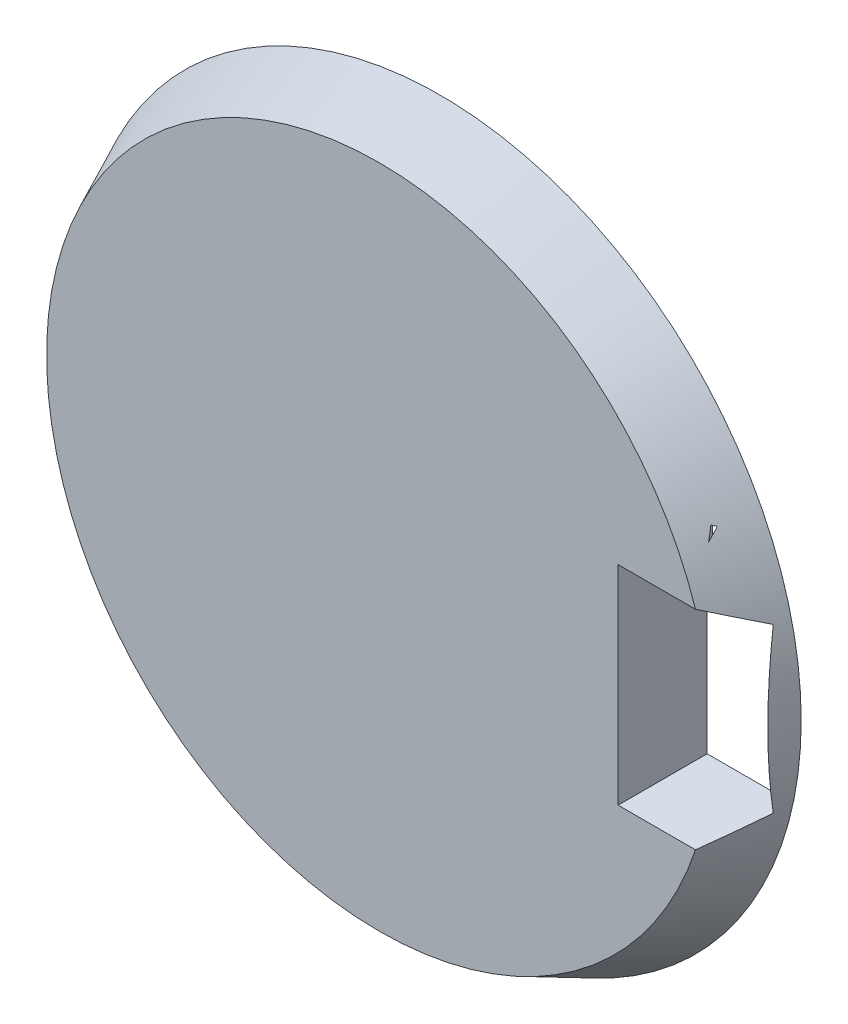
ISO-10303-21;
HEADER;
FILE_DESCRIPTION(('STEP AP214'),'2;1');
FILE_NAME('part.step','',(''),(''),'','','');
FILE_SCHEMA(('AUTOMOTIVE_DESIGN { 1 0 10303 214 1 1 1 1 }'));
ENDSEC;
DATA;
#1=APPLICATION_CONTEXT('core data for automotive mechanical design processes');
#2=APPLICATION_PROTOCOL_DEFINITION('international standard','automotive_design',2000,#1);
#3=PRODUCT_CONTEXT('',#1,'mechanical');
#4=PRODUCT('Part','Part','',(#3));
#5=PRODUCT_RELATED_PRODUCT_CATEGORY('part','',(#4));
#6=PRODUCT_DEFINITION_FORMATION('','',#4);
#7=PRODUCT_DEFINITION_CONTEXT('part definition',#1,'design');
#8=PRODUCT_DEFINITION('design','',#6,#7);
#9=PRODUCT_DEFINITION_SHAPE('','',#8);
#10=(LENGTH_UNIT() NAMED_UNIT(*) SI_UNIT(.MILLI.,.METRE.));
#11=(NAMED_UNIT(*) PLANE_ANGLE_UNIT() SI_UNIT($,.RADIAN.));
#12=(NAMED_UNIT(*) SI_UNIT($,.STERADIAN.) SOLID_ANGLE_UNIT());
#13=UNCERTAINTY_MEASURE_WITH_UNIT(LENGTH_MEASURE(1.E-05),#10,'distance_accuracy_value','');
#14=(GEOMETRIC_REPRESENTATION_CONTEXT(3) GLOBAL_UNCERTAINTY_ASSIGNED_CONTEXT((#13)) GLOBAL_UNIT_ASSIGNED_CONTEXT((#10,
#11,#12)) REPRESENTATION_CONTEXT('',''));
#15=CARTESIAN_POINT('',(0.,0.,0.));
#16=DIRECTION('',(0.,0.,1.));
#17=DIRECTION('',(1.,0.,0.));
#18=AXIS2_PLACEMENT_3D('',#15,#16,#17);
#19=CARTESIAN_POINT('',(8.8,2.5,0.));
#20=DIRECTION('',(0.,-0.90630778703665,0.4226182617407));
#21=DIRECTION('',(0.,-0.4226182617407,-0.90630778703665));
#22=AXIS2_PLACEMENT_3D('',#19,#20,#21);
#23=PLANE('',#22);
#24=DIRECTION('',(0.,0.4226182617407,0.906307787036649));
#25=VECTOR('',#24,1.);
#26=CARTESIAN_POINT('',(10.1707952564834,3.43261531631,2.));
#27=LINE('',#26,#25);
#28=CARTESIAN_POINT('',(10.1707952564834,2.5,0.));
#29=VERTEX_POINT('',#28);
#30=CARTESIAN_POINT('',(10.1707952564834,3.43261531631,2.));
#31=VERTEX_POINT('',#30);
#32=EDGE_CURVE('E64',#29,#31,#27,.T.);
#33=ORIENTED_EDGE('',*,*,#32,.F.);
#34=DIRECTION('',(-1.,0.,0.));
#35=VECTOR('',#34,1.);
#36=CARTESIAN_POINT('',(8.8,2.5,0.));
#37=LINE('',#36,#35);
#38=CARTESIAN_POINT('',(11.2,2.5,0.));
#39=VERTEX_POINT('',#38);
#40=EDGE_CURVE('E247',#39,#29,#37,.T.);
#41=ORIENTED_EDGE('',*,*,#40,.F.);
#42=DIRECTION('',(-0.389281620635026,-0.389281620635026,-0.834817129478987));
#43=VECTOR('',#42,1.);
#44=CARTESIAN_POINT('',(10.8363035676058,2.13630356760585,-0.779949516233904));
#45=LINE('',#44,#43);
#46=CARTESIAN_POINT('',(11.3930223122456,2.69302231224562,0.413937684423472));
#47=VERTEX_POINT('',#46);
#48=EDGE_CURVE('E241',#47,#39,#45,.T.);
#49=ORIENTED_EDGE('',*,*,#48,.F.);
#50=CARTESIAN_POINT('',(12.5694296653311,1.71421659334357,-1.6851179535963));
#51=CARTESIAN_POINT('',(12.4020881559186,1.8602663056751,-1.3719133347629));
#52=CARTESIAN_POINT('',(12.232067978909,2.00577406522976,-1.0598709374101));
#53=CARTESIAN_POINT('',(11.8860741135527,2.29553187277096,-0.438483313866315));
#54=CARTESIAN_POINT('',(11.7101000011039,2.43978183023921,-0.129138281792436));
#55=CARTESIAN_POINT('',(11.3520833270081,2.72646297041828,0.485651407301144));
#56=CARTESIAN_POINT('',(11.1700574020714,2.86889785580036,0.791104004725003));
#57=CARTESIAN_POINT('',(10.7988106397738,3.15208889698565,1.39840915237316));
#58=CARTESIAN_POINT('',(10.6095896895449,3.29284502640874,1.70026164602512));
#59=CARTESIAN_POINT('',(10.2229016935578,3.57255953685384,2.30011134944158));
#60=CARTESIAN_POINT('',(10.0254246793454,3.71151546278486,2.59810329424647));
#61=CARTESIAN_POINT('',(9.62150301454988,3.98706495719527,3.18902109195248));
#62=CARTESIAN_POINT('',(9.41505927677605,4.12365876416739,3.48194745630296));
#63=CARTESIAN_POINT('',(8.99150638037919,4.39436799117154,4.06248526705914));
#64=CARTESIAN_POINT('',(8.77437178869183,4.52847634189704,4.35008155328809));
#65=CARTESIAN_POINT('',(8.43997573568999,4.72705637819265,4.77593781539907));
#66=CARTESIAN_POINT('',(8.32703885436555,4.79283168038183,4.91699340614238));
#67=CARTESIAN_POINT('',(8.09806469727044,4.92341785634088,5.19703636420943));
#68=CARTESIAN_POINT('',(7.98202720531553,4.98822866236998,5.33602358626265));
#69=CARTESIAN_POINT('',(7.86434008736167,5.05250538160821,5.47386545549667));
#70=B_SPLINE_CURVE_WITH_KNOTS('',3,(#50,#51,#52,#53,#54,#55,#56,#57,#58,#59,#60,#61,#62,#63,#64,
#65,#66,#67,#68,#69),.UNSPECIFIED.,.F.,.F.,(4,2,2,2,2,2,2,2,2,4),(0.,1.15190984547732,
2.30390191560036,3.45295344705957,4.60202301108419,5.75252248133409,6.90290510440253,
8.05617082448155,8.63302507757688,9.20991965623952),.UNSPECIFIED.);
#71=CARTESIAN_POINT('',(10.4163659157247,3.43261531631,2.));
#72=VERTEX_POINT('',#71);
#73=EDGE_CURVE('E220',#47,#72,#70,.T.);
#74=ORIENTED_EDGE('',*,*,#73,.T.);
#75=DIRECTION('',(-1.,0.,0.));
#76=VECTOR('',#75,1.);
#77=CARTESIAN_POINT('',(8.8,3.43261531631,2.));
#78=LINE('',#77,#76);
#79=EDGE_CURVE('E211',#72,#31,#78,.T.);
#80=ORIENTED_EDGE('',*,*,#79,.T.);
#81=EDGE_LOOP('',(#33,#41,#49,#74,#80));
#82=FACE_BOUND('',#81,.T.);
#83=ADVANCED_FACE('F35',(#82),#23,.T.);
#84=CARTESIAN_POINT('',(0.,0.,2.));
#85=DIRECTION('',(0.,0.,1.));
#86=DIRECTION('',(1.,0.,0.));
#87=AXIS2_PLACEMENT_3D('',#84,#85,#86);
#88=PLANE('',#87);
#89=ORIENTED_EDGE('',*,*,#79,.F.);
#90=CARTESIAN_POINT('',(0.,0.,2.));
#91=DIRECTION('',(0.,0.,1.));
#92=DIRECTION('',(1.,0.,0.));
#93=AXIS2_PLACEMENT_3D('',#90,#91,#92);
#94=CIRCLE('',#93,10.96738468369);
#95=CARTESIAN_POINT('',(10.4163659157247,-3.43261531631,2.));
#96=VERTEX_POINT('',#95);
#97=EDGE_CURVE('E227',#72,#96,#94,.T.);
#98=ORIENTED_EDGE('',*,*,#97,.T.);
#99=DIRECTION('',(1.,0.,0.));
#100=VECTOR('',#99,1.);
#101=CARTESIAN_POINT('',(8.8,-3.43261531631,2.));
#102=LINE('',#101,#100);
#103=CARTESIAN_POINT('',(7.86738468369,-3.43261531631,2.));
#104=VERTEX_POINT('',#103);
#105=EDGE_CURVE('E259',#104,#96,#102,.T.);
#106=ORIENTED_EDGE('',*,*,#105,.F.);
#107=DIRECTION('',(0.,-1.,0.));
#108=VECTOR('',#107,1.);
#109=CARTESIAN_POINT('',(7.86738468369,2.5,2.));
#110=LINE('',#109,#108);
#111=CARTESIAN_POINT('',(7.86738468369,3.43261531631,2.));
#112=VERTEX_POINT('',#111);
#113=EDGE_CURVE('E210',#112,#104,#110,.T.);
#114=ORIENTED_EDGE('',*,*,#113,.F.);
#115=CARTESIAN_POINT('',(8.97108004322399,3.43261531631,2.));
#116=VERTEX_POINT('',#115);
#117=EDGE_CURVE('E203',#116,#112,#78,.T.);
#118=ORIENTED_EDGE('',*,*,#117,.F.);
#119=DIRECTION('',(-1.,0.,0.));
#120=VECTOR('',#119,1.);
#121=CARTESIAN_POINT('',(8.97108004322399,3.43261531631,2.));
#122=LINE('',#121,#120);
#123=EDGE_CURVE('E132',#31,#116,#122,.T.);
#124=ORIENTED_EDGE('',*,*,#123,.F.);
#125=EDGE_LOOP('',(#89,#98,#106,#114,#118,#124));
#126=FACE_BOUND('',#125,.T.);
#127=ADVANCED_FACE('F171',(#126),#88,.T.);
#128=CARTESIAN_POINT('',(0.,0.,0.));
#129=DIRECTION('',(0.,0.,1.));
#130=DIRECTION('',(1.,0.,0.));
#131=AXIS2_PLACEMENT_3D('',#128,#129,#130);
#132=PLANE('',#131);
#133=ORIENTED_EDGE('',*,*,#40,.T.);
#134=DIRECTION('',(0.,1.,0.));
#135=VECTOR('',#134,1.);
#136=CARTESIAN_POINT('',(10.1707952564834,0.,0.));
#137=LINE('',#136,#135);
#138=CARTESIAN_POINT('',(10.1707952564834,4.70675583792499,0.));
#139=VERTEX_POINT('',#138);
#140=EDGE_CURVE('E159',#29,#139,#137,.T.);
#141=ORIENTED_EDGE('',*,*,#140,.T.);
#142=DIRECTION('',(1.,0.,0.));
#143=VECTOR('',#142,1.);
#144=CARTESIAN_POINT('',(0.,4.70675583792499,0.));
#145=LINE('',#144,#143);
#146=CARTESIAN_POINT('',(8.97108004322399,4.70675583792499,0.));
#147=VERTEX_POINT('',#146);
#148=EDGE_CURVE('E272',#147,#139,#145,.T.);
#149=ORIENTED_EDGE('',*,*,#148,.F.);
#150=DIRECTION('',(0.,-1.,0.));
#151=VECTOR('',#150,1.);
#152=CARTESIAN_POINT('',(8.97108004322399,0.,0.));
#153=LINE('',#152,#151);
#154=CARTESIAN_POINT('',(8.97108004322399,2.5,0.));
#155=VERTEX_POINT('',#154);
#156=EDGE_CURVE('E140',#147,#155,#153,.T.);
#157=ORIENTED_EDGE('',*,*,#156,.T.);
#158=CARTESIAN_POINT('',(8.8,2.5,0.));
#159=VERTEX_POINT('',#158);
#160=EDGE_CURVE('E205',#155,#159,#37,.T.);
#161=ORIENTED_EDGE('',*,*,#160,.T.);
#162=DIRECTION('',(0.,-1.,0.));
#163=VECTOR('',#162,1.);
#164=CARTESIAN_POINT('',(8.8,2.5,0.));
#165=LINE('',#164,#163);
#166=CARTESIAN_POINT('',(8.8,-2.5,0.));
#167=VERTEX_POINT('',#166);
#168=EDGE_CURVE('E215',#159,#167,#165,.T.);
#169=ORIENTED_EDGE('',*,*,#168,.T.);
#170=DIRECTION('',(1.,0.,0.));
#171=VECTOR('',#170,1.);
#172=CARTESIAN_POINT('',(8.8,-2.5,0.));
#173=LINE('',#172,#171);
#174=CARTESIAN_POINT('',(11.2,-2.5,0.));
#175=VERTEX_POINT('',#174);
#176=EDGE_CURVE('E212',#167,#175,#173,.T.);
#177=ORIENTED_EDGE('',*,*,#176,.T.);
#178=DIRECTION('',(0.,1.,0.));
#179=VECTOR('',#178,1.);
#180=CARTESIAN_POINT('',(11.2,2.5,0.));
#181=LINE('',#180,#179);
#182=EDGE_CURVE('E271',#175,#39,#181,.T.);
#183=ORIENTED_EDGE('',*,*,#182,.T.);
#184=EDGE_LOOP('',(#133,#141,#149,#157,#161,#169,#177,#183));
#185=FACE_BOUND('',#184,.T.);
#186=CARTESIAN_POINT('',(0.,0.,0.));
#187=DIRECTION('',(0.,0.,1.));
#188=DIRECTION('',(1.,0.,0.));
#189=AXIS2_PLACEMENT_3D('',#186,#187,#188);
#190=CIRCLE('',#189,11.9);
#191=CARTESIAN_POINT('',(11.9,0.,0.));
#192=VERTEX_POINT('',#191);
#193=EDGE_CURVE('E249',#192,#192,#190,.T.);
#194=ORIENTED_EDGE('',*,*,#193,.F.);
#195=EDGE_LOOP('',(#194));
#196=FACE_BOUND('',#195,.T.);
#197=ADVANCED_FACE('F173',(#185,#196),#132,.F.);
#198=CARTESIAN_POINT('',(0.,0.,0.));
#199=DIRECTION('',(0.,0.,-1.));
#200=DIRECTION('',(1.,0.,0.));
#201=AXIS2_PLACEMENT_3D('',#198,#199,#200);
#202=CONICAL_SURFACE('',#201,11.9,0.436332312998583);
#203=CARTESIAN_POINT('',(10.1709952564834,5.18870743434082,1.03354853386437));
#204=CARTESIAN_POINT('',(10.1555656592916,5.19815759943512,1.05381447830907));
#205=CARTESIAN_POINT('',(10.1401120901725,5.20760074176662,1.07406536239033));
#206=CARTESIAN_POINT('',(10.109157007991,5.22647298095807,1.11453700994191));
#207=CARTESIAN_POINT('',(10.0936554949282,5.23590207781795,1.13475777341206));
#208=CARTESIAN_POINT('',(10.0781300099379,5.24532415191493,1.1549634765186));
#209=B_SPLINE_CURVE_WITH_KNOTS('',3,(#203,#204,#205,#206,#207,#208),.UNSPECIFIED.,.F.,.F.,(4,2,
4),(0.,0.0815031065368539,0.163006213540716),.UNSPECIFIED.);
#210=CARTESIAN_POINT('',(10.1707952564834,5.18882992539633,1.03381121678063));
#211=VERTEX_POINT('',#210);
#212=CARTESIAN_POINT('',(10.0782836852403,5.2452308903833,1.1547634765186));
#213=VERTEX_POINT('',#212);
#214=EDGE_CURVE('E11',#211,#213,#209,.T.);
#215=ORIENTED_EDGE('',*,*,#214,.F.);
#216=CARTESIAN_POINT('',(10.1707952564834,9.38576864131933,-4.15973362477265));
#217=CARTESIAN_POINT('',(10.1707952564834,9.22986084265301,-3.93301773600076));
#218=CARTESIAN_POINT('',(10.1707952564834,9.07255045182738,-3.70725647187416));
#219=CARTESIAN_POINT('',(10.1707952564834,8.75470122984462,-3.25797923497355));
#220=CARTESIAN_POINT('',(10.1707952564834,8.59416201492303,-3.03446353388875));
#221=CARTESIAN_POINT('',(10.1707952564834,8.26920640992656,-2.58970848647703));
#222=CARTESIAN_POINT('',(10.1707952564834,8.10478416910696,-2.36847340643358));
#223=CARTESIAN_POINT('',(10.1707952564834,7.77181757894781,-1.92913390604432));
#224=CARTESIAN_POINT('',(10.1707952564834,7.60327337745625,-1.71102937385489));
#225=CARTESIAN_POINT('',(10.1707952564834,7.26553436171465,-1.28369475821025));
#226=CARTESIAN_POINT('',(10.1707952564834,7.09645067344273,-1.07437703583552));
#227=CARTESIAN_POINT('',(10.1707952564834,6.75312756166177,-0.660016696897339));
#228=CARTESIAN_POINT('',(10.1707952564834,6.57888835194832,-0.454973903655201));
#229=CARTESIAN_POINT('',(10.1707952564834,6.22443916942975,-0.0500681812466166));
#230=CARTESIAN_POINT('',(10.1707952564834,6.044228735456,0.149794345703886));
#231=CARTESIAN_POINT('',(10.1707952564834,5.67691392075882,0.543065872521169));
#232=CARTESIAN_POINT('',(10.1707952564834,5.48981021664286,0.736475502238309));
#233=CARTESIAN_POINT('',(10.1707952564834,5.0573540133649,1.16498227580979));
#234=CARTESIAN_POINT('',(10.1707952564834,4.80961008049316,1.39768588992763));
#235=CARTESIAN_POINT('',(10.1707952564834,4.29898576094776,1.84519927593756));
#236=CARTESIAN_POINT('',(10.1707952564834,4.03613399389273,2.06004111010144));
#237=CARTESIAN_POINT('',(10.1707952564834,3.62601130610405,2.36527768329628));
#238=CARTESIAN_POINT('',(10.1707952564834,3.48556726611504,2.46485497007477));
#239=CARTESIAN_POINT('',(10.1707952564834,3.1995920311101,2.65633194557442));
#240=CARTESIAN_POINT('',(10.1707952564834,3.05406292476317,2.74823473518192));
#241=CARTESIAN_POINT('',(10.1707952564834,2.75666533909821,2.92343654879817));
#242=CARTESIAN_POINT('',(10.1707952564834,2.60476365976027,3.00667978730836));
#243=CARTESIAN_POINT('',(10.1707952564834,2.29517021391734,3.16215813469007));
#244=CARTESIAN_POINT('',(10.1707952564834,2.13747026824301,3.23437689018454));
#245=CARTESIAN_POINT('',(10.1707952564834,1.97695081742833,3.30007640350213));
#246=B_SPLINE_CURVE_WITH_KNOTS('',3,(#216,#217,#218,#219,#220,#221,#222,#223,#224,#225,#226,
#227,#228,#229,#230,#231,#232,#233,#234,#235,#236,#237,#238,#239,#240,#241,#242,#243,#244,#245),
.UNSPECIFIED.,.F.,.F.,(4,2,2,2,2,2,2,2,2,2,2,2,2,2,4),(0.,0.825455895391268,1.65101048767588,
2.47790027527318,3.30476044706047,4.11192503025201,4.91905618771885,5.72624982737459,
6.53336444709921,7.55247294423045,8.56971074110797,9.08600073875203,9.60208110937407,
10.1213033513969,10.6412884600426),.UNSPECIFIED.);
#247=CARTESIAN_POINT('',(10.1707952564834,4.88545142875096,1.32253139472464));
#248=VERTEX_POINT('',#247);
#249=EDGE_CURVE('E151',#211,#248,#246,.T.);
#250=ORIENTED_EDGE('',*,*,#249,.T.);
#251=CARTESIAN_POINT('',(0.,2.33277732196623,2.51286287949234));
#252=DIRECTION('',(0.,0.4226182617407,0.90630778703665));
#253=DIRECTION('',(0.,0.90630778703665,-0.4226182617407));
#254=AXIS2_PLACEMENT_3D('',#251,#252,#253);
#255=ELLIPSE('',#254,11.8372951759328,10.471538992832);
#256=EDGE_CURVE('E135',#248,#213,#255,.T.);
#257=ORIENTED_EDGE('',*,*,#256,.T.);
#258=EDGE_LOOP('',(#215,#250,#257));
#259=FACE_BOUND('',#258,.T.);
#260=CARTESIAN_POINT('',(11.2949302814742,-3.43281531631,0.20357864558732));
#261=CARTESIAN_POINT('',(11.3154183512331,-3.29495048705313,0.247515452973247));
#262=CARTESIAN_POINT('',(11.3348054740984,-3.15618031591309,0.289091272126703));
#263=CARTESIAN_POINT('',(11.3712719859884,-2.87693187349919,0.367293959241455));
#264=CARTESIAN_POINT('',(11.3883510392506,-2.73645335693974,0.403920107158001));
#265=CARTESIAN_POINT('',(11.4359761482658,-2.31251541959326,0.506052483031256));
#266=CARTESIAN_POINT('',(11.4628875286453,-2.02670451229958,0.563764124495455));
#267=CARTESIAN_POINT('',(11.5056144323738,-1.4590504898723,0.655392265233311));
#268=CARTESIAN_POINT('',(11.521729660973,-1.17733341457245,0.689951484489821));
#269=CARTESIAN_POINT('',(11.5436290861257,-0.61175903753764,0.736914953285));
#270=CARTESIAN_POINT('',(11.54941776907,-0.32790271905514,0.749328823919618));
#271=CARTESIAN_POINT('',(11.5505119929157,0.247033557233243,0.751675394529351));
#272=CARTESIAN_POINT('',(11.5455516402225,0.538116568207254,0.741037883850499));
#273=CARTESIAN_POINT('',(11.5247575958426,1.11821269841057,0.696444911772473));
#274=CARTESIAN_POINT('',(11.508918609263,1.40722474040361,0.662478095438634));
#275=CARTESIAN_POINT('',(11.4661937595361,1.98978767091211,0.57085435952159));
#276=CARTESIAN_POINT('',(11.4389839632695,2.2832058751264,0.512502763122221));
#277=CARTESIAN_POINT('',(11.3905143971497,2.71832684962322,0.408559443144209));
#278=CARTESIAN_POINT('',(11.3730882198556,2.86249174017305,0.371188885338956));
#279=CARTESIAN_POINT('',(11.3358040362388,3.14902683165847,0.291232695547324));
#280=CARTESIAN_POINT('',(11.3159464116692,3.29139731046679,0.248647882232823));
#281=CARTESIAN_POINT('',(11.2949302814742,3.43281531631,0.203578645587315));
#282=B_SPLINE_CURVE_WITH_KNOTS('',3,(#260,#261,#262,#263,#264,#265,#266,#267,#268,#269,#270,
#271,#272,#273,#274,#275,#276,#277,#278,#279,#280,#281),.UNSPECIFIED.,.F.,.F.,(4,2,2,2,2,2,2,2,
2,2,4),(0.,0.438369325865525,0.876802354251005,1.75414738189459,2.60599806415531,
3.45747856777931,4.33026166424653,5.20346986657817,6.10346147401013,6.5531967421988,
7.00286148936398),.UNSPECIFIED.);
#283=CARTESIAN_POINT('',(11.3930223122456,-2.69302231224561,0.413937684423474));
#284=VERTEX_POINT('',#283);
#285=EDGE_CURVE('E50',#284,#47,#282,.T.);
#286=ORIENTED_EDGE('',*,*,#285,.F.);
#287=CARTESIAN_POINT('',(12.5694296653311,-1.71421659334356,-1.6851179535963));
#288=CARTESIAN_POINT('',(12.4020881559186,-1.86026630567509,-1.3719133347629));
#289=CARTESIAN_POINT('',(12.232067978909,-2.00577406522975,-1.0598709374101));
#290=CARTESIAN_POINT('',(11.8860741135527,-2.29553187277095,-0.438483313866315));
#291=CARTESIAN_POINT('',(11.7101000011039,-2.43978183023921,-0.129138281792436));
#292=CARTESIAN_POINT('',(11.3520833270081,-2.72646297041827,0.485651407301143));
#293=CARTESIAN_POINT('',(11.1700574020714,-2.86889785580035,0.791104004725002));
#294=CARTESIAN_POINT('',(10.7988106397738,-3.15208889698564,1.39840915237316));
#295=CARTESIAN_POINT('',(10.6095896895449,-3.29284502640874,1.70026164602512));
#296=CARTESIAN_POINT('',(10.2229016935578,-3.57255953685383,2.30011134944158));
#297=CARTESIAN_POINT('',(10.0254246793454,-3.71151546278486,2.59810329424647));
#298=CARTESIAN_POINT('',(9.62150301454989,-3.98706495719526,3.18902109195248));
#299=CARTESIAN_POINT('',(9.41505927677606,-4.12365876416739,3.48194745630296));
#300=CARTESIAN_POINT('',(8.99150638037919,-4.39436799117153,4.06248526705914));
#301=CARTESIAN_POINT('',(8.77437178869184,-4.52847634189703,4.35008155328809));
#302=CARTESIAN_POINT('',(8.43997573568999,-4.72705637819264,4.77593781539907));
#303=CARTESIAN_POINT('',(8.32703885436556,-4.79283168038183,4.91699340614238));
#304=CARTESIAN_POINT('',(8.09806469727045,-4.92341785634087,5.19703636420944));
#305=CARTESIAN_POINT('',(7.98202720531553,-4.98822866236998,5.33602358626265));
#306=CARTESIAN_POINT('',(7.86434008736167,-5.0525053816082,5.47386545549667));
#307=B_SPLINE_CURVE_WITH_KNOTS('',3,(#287,#288,#289,#290,#291,#292,#293,#294,#295,#296,#297,
#298,#299,#300,#301,#302,#303,#304,#305,#306),.UNSPECIFIED.,.F.,.F.,(4,2,2,2,2,2,2,2,2,4),(0.,
1.15190984547732,2.30390191560036,3.45295344705957,4.60202301108419,5.75252248133408,
6.90290510440253,8.05617082448155,8.63302507757688,9.20991965623952),.UNSPECIFIED.);
#308=EDGE_CURVE('E226',#284,#96,#307,.T.);
#309=ORIENTED_EDGE('',*,*,#308,.T.);
#310=ORIENTED_EDGE('',*,*,#97,.F.);
#311=ORIENTED_EDGE('',*,*,#73,.F.);
#312=EDGE_LOOP('',(#286,#309,#310,#311));
#313=FACE_BOUND('',#312,.T.);
#314=ORIENTED_EDGE('',*,*,#193,.T.);
#315=EDGE_LOOP('',(#314));
#316=FACE_BOUND('',#315,.T.);
#317=ADVANCED_FACE('F161',(#259,#313,#316),#202,.T.);
#318=CARTESIAN_POINT('',(11.2,2.5,0.));
#319=DIRECTION('',(-0.90630778703665,0.,0.4226182617407));
#320=DIRECTION('',(0.4226182617407,0.,0.90630778703665));
#321=AXIS2_PLACEMENT_3D('',#318,#319,#320);
#322=PLANE('',#321);
#323=DIRECTION('',(-0.389281620635026,0.389281620635026,-0.834817129478987));
#324=VECTOR('',#323,1.);
#325=CARTESIAN_POINT('',(10.4422990991788,-1.74229909917884,-1.6248948254873));
#326=LINE('',#325,#324);
#327=EDGE_CURVE('E243',#284,#175,#326,.T.);
#328=ORIENTED_EDGE('',*,*,#327,.F.);
#329=ORIENTED_EDGE('',*,*,#285,.T.);
#330=ORIENTED_EDGE('',*,*,#48,.T.);
#331=ORIENTED_EDGE('',*,*,#182,.F.);
#332=EDGE_LOOP('',(#328,#329,#330,#331));
#333=FACE_BOUND('',#332,.T.);
#334=ADVANCED_FACE('F180',(#333),#322,.T.);
#335=DIRECTION('',(0.,-0.4226182617407,-0.906307787036649));
#336=VECTOR('',#335,1.);
#337=CARTESIAN_POINT('',(8.97108004322399,3.43261531631,2.));
#338=LINE('',#337,#336);
#339=EDGE_CURVE('E147',#116,#155,#338,.T.);
#340=ORIENTED_EDGE('',*,*,#339,.F.);
#341=ORIENTED_EDGE('',*,*,#117,.T.);
#342=DIRECTION('',(0.389281620635026,-0.389281620635026,-0.834817129478987));
#343=VECTOR('',#342,1.);
#344=CARTESIAN_POINT('',(8.8,2.5,0.));
#345=LINE('',#344,#343);
#346=EDGE_CURVE('E250',#112,#159,#345,.T.);
#347=ORIENTED_EDGE('',*,*,#346,.T.);
#348=ORIENTED_EDGE('',*,*,#160,.F.);
#349=EDGE_LOOP('',(#340,#341,#347,#348));
#350=FACE_BOUND('',#349,.T.);
#351=ADVANCED_FACE('F187',(#350),#23,.T.);
#352=CARTESIAN_POINT('',(8.8,2.5,0.));
#353=DIRECTION('',(0.90630778703665,0.,0.4226182617407));
#354=DIRECTION('',(0.4226182617407,0.,-0.90630778703665));
#355=AXIS2_PLACEMENT_3D('',#352,#353,#354);
#356=PLANE('',#355);
#357=ORIENTED_EDGE('',*,*,#168,.F.);
#358=ORIENTED_EDGE('',*,*,#346,.F.);
#359=ORIENTED_EDGE('',*,*,#113,.T.);
#360=DIRECTION('',(0.389281620635026,0.389281620635026,-0.834817129478987));
#361=VECTOR('',#360,1.);
#362=CARTESIAN_POINT('',(8.8,-2.5,0.));
#363=LINE('',#362,#361);
#364=EDGE_CURVE('E254',#104,#167,#363,.T.);
#365=ORIENTED_EDGE('',*,*,#364,.T.);
#366=EDGE_LOOP('',(#357,#358,#359,#365));
#367=FACE_BOUND('',#366,.T.);
#368=ADVANCED_FACE('F192',(#367),#356,.T.);
#369=CARTESIAN_POINT('',(8.8,-2.5,0.));
#370=DIRECTION('',(0.,0.90630778703665,0.4226182617407));
#371=DIRECTION('',(0.,-0.4226182617407,0.90630778703665));
#372=AXIS2_PLACEMENT_3D('',#369,#370,#371);
#373=PLANE('',#372);
#374=ORIENTED_EDGE('',*,*,#308,.F.);
#375=ORIENTED_EDGE('',*,*,#327,.T.);
#376=ORIENTED_EDGE('',*,*,#176,.F.);
#377=ORIENTED_EDGE('',*,*,#364,.F.);
#378=ORIENTED_EDGE('',*,*,#105,.T.);
#379=EDGE_LOOP('',(#374,#375,#376,#377,#378));
#380=FACE_BOUND('',#379,.T.);
#381=ADVANCED_FACE('F37',(#380),#373,.T.);
#382=CARTESIAN_POINT('',(0.,3.86610008618147,-1.80279207738013));
#383=DIRECTION('',(0.,-0.906307787036649,0.4226182617407));
#384=DIRECTION('',(0.,-0.4226182617407,-0.906307787036649));
#385=AXIS2_PLACEMENT_3D('',#382,#383,#384);
#386=PLANE('',#385);
#387=ORIENTED_EDGE('',*,*,#148,.T.);
#388=DIRECTION('',(0.,0.4226182617407,0.906307787036649));
#389=VECTOR('',#388,1.);
#390=CARTESIAN_POINT('',(10.1707952564834,5.2452308903833,1.1547634765186));
#391=LINE('',#390,#389);
#392=EDGE_CURVE('E56',#139,#211,#391,.T.);
#393=ORIENTED_EDGE('',*,*,#392,.T.);
#394=ORIENTED_EDGE('',*,*,#214,.T.);
#395=DIRECTION('',(-1.,0.,0.));
#396=VECTOR('',#395,1.);
#397=CARTESIAN_POINT('',(8.97108004322399,5.2452308903833,1.1547634765186));
#398=LINE('',#397,#396);
#399=CARTESIAN_POINT('',(8.97108004322399,5.2452308903833,1.1547634765186));
#400=VERTEX_POINT('',#399);
#401=EDGE_CURVE('E118',#213,#400,#398,.T.);
#402=ORIENTED_EDGE('',*,*,#401,.T.);
#403=DIRECTION('',(0.,-0.4226182617407,-0.906307787036649));
#404=VECTOR('',#403,1.);
#405=CARTESIAN_POINT('',(8.97108004322399,5.2452308903833,1.1547634765186));
#406=LINE('',#405,#404);
#407=EDGE_CURVE('E122',#400,#147,#406,.T.);
#408=ORIENTED_EDGE('',*,*,#407,.T.);
#409=EDGE_LOOP('',(#387,#393,#394,#402,#408));
#410=FACE_BOUND('',#409,.T.);
#411=ADVANCED_FACE('F120',(#410),#386,.T.);
#412=CARTESIAN_POINT('',(10.1707952564834,5.2452308903833,1.1547634765186));
#413=DIRECTION('',(1.,0.,0.));
#414=DIRECTION('',(0.,0.,-1.));
#415=AXIS2_PLACEMENT_3D('',#412,#413,#414);
#416=PLANE('',#415);
#417=ORIENTED_EDGE('',*,*,#32,.T.);
#418=DIRECTION('',(0.,-0.90630778703665,0.4226182617407));
#419=VECTOR('',#418,1.);
#420=CARTESIAN_POINT('',(10.1707952564834,5.2452308903833,1.1547634765186));
#421=LINE('',#420,#419);
#422=EDGE_CURVE('E136',#248,#31,#421,.T.);
#423=ORIENTED_EDGE('',*,*,#422,.F.);
#424=ORIENTED_EDGE('',*,*,#249,.F.);
#425=ORIENTED_EDGE('',*,*,#392,.F.);
#426=ORIENTED_EDGE('',*,*,#140,.F.);
#427=EDGE_LOOP('',(#417,#423,#424,#425,#426));
#428=FACE_BOUND('',#427,.T.);
#429=ADVANCED_FACE('F165',(#428),#416,.F.);
#430=CARTESIAN_POINT('',(8.97108004322399,5.2452308903833,1.1547634765186));
#431=DIRECTION('',(-1.,0.,0.));
#432=DIRECTION('',(0.,0.,1.));
#433=AXIS2_PLACEMENT_3D('',#430,#431,#432);
#434=PLANE('',#433);
#435=ORIENTED_EDGE('',*,*,#407,.F.);
#436=DIRECTION('',(0.,-0.90630778703665,0.4226182617407));
#437=VECTOR('',#436,1.);
#438=CARTESIAN_POINT('',(8.97108004322399,5.2452308903833,1.1547634765186));
#439=LINE('',#438,#437);
#440=EDGE_CURVE('E129',#400,#116,#439,.T.);
#441=ORIENTED_EDGE('',*,*,#440,.T.);
#442=ORIENTED_EDGE('',*,*,#339,.T.);
#443=ORIENTED_EDGE('',*,*,#156,.F.);
#444=EDGE_LOOP('',(#435,#441,#442,#443));
#445=FACE_BOUND('',#444,.T.);
#446=ADVANCED_FACE('F138',(#445),#434,.F.);
#447=CARTESIAN_POINT('',(8.97108004322399,5.2452308903833,1.1547634765186));
#448=DIRECTION('',(0.,0.4226182617407,0.90630778703665));
#449=DIRECTION('',(0.,-0.906307787036649,0.4226182617407));
#450=AXIS2_PLACEMENT_3D('',#447,#448,#449);
#451=PLANE('',#450);
#452=ORIENTED_EDGE('',*,*,#422,.T.);
#453=ORIENTED_EDGE('',*,*,#123,.T.);
#454=ORIENTED_EDGE('',*,*,#440,.F.);
#455=ORIENTED_EDGE('',*,*,#401,.F.);
#456=ORIENTED_EDGE('',*,*,#256,.F.);
#457=EDGE_LOOP('',(#452,#453,#454,#455,#456));
#458=FACE_BOUND('',#457,.T.);
#459=ADVANCED_FACE('F130',(#458),#451,.F.);
#460=CLOSED_SHELL('',(#83,#127,#197,#317,#334,#351,#368,#381,#411,#429,#446,#459));
#461=MANIFOLD_SOLID_BREP('B2',#460);
#462=ADVANCED_BREP_SHAPE_REPRESENTATION('',(#18,#461),#14);
#463=SHAPE_DEFINITION_REPRESENTATION(#9,#462);
ENDSEC;
END-ISO-10303-21;
